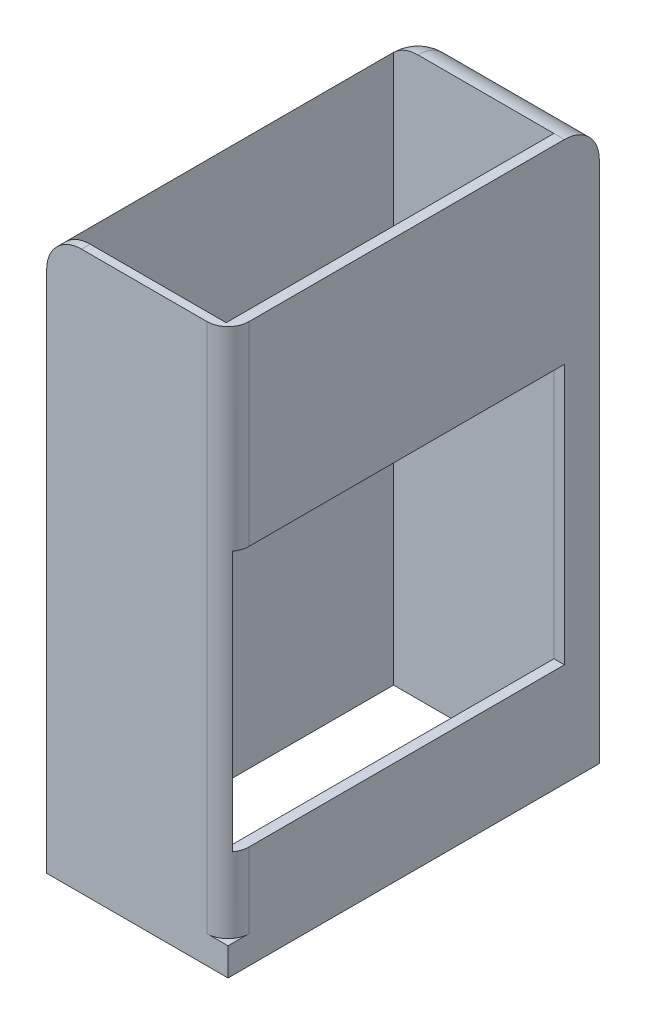
ISO-10303-21;
HEADER;
FILE_DESCRIPTION(('STEP AP214'),'2;1');
FILE_NAME('part.step','',(''),(''),'','','');
FILE_SCHEMA(('AUTOMOTIVE_DESIGN { 1 0 10303 214 1 1 1 1 }'));
ENDSEC;
DATA;
#1=APPLICATION_CONTEXT('core data for automotive mechanical design processes');
#2=APPLICATION_PROTOCOL_DEFINITION('international standard','automotive_design',2000,#1);
#3=PRODUCT_CONTEXT('',#1,'mechanical');
#4=PRODUCT('Part','Part','',(#3));
#5=PRODUCT_RELATED_PRODUCT_CATEGORY('part','',(#4));
#6=PRODUCT_DEFINITION_FORMATION('','',#4);
#7=PRODUCT_DEFINITION_CONTEXT('part definition',#1,'design');
#8=PRODUCT_DEFINITION('design','',#6,#7);
#9=PRODUCT_DEFINITION_SHAPE('','',#8);
#10=(LENGTH_UNIT() NAMED_UNIT(*) SI_UNIT(.MILLI.,.METRE.));
#11=(NAMED_UNIT(*) PLANE_ANGLE_UNIT() SI_UNIT($,.RADIAN.));
#12=(NAMED_UNIT(*) SI_UNIT($,.STERADIAN.) SOLID_ANGLE_UNIT());
#13=UNCERTAINTY_MEASURE_WITH_UNIT(LENGTH_MEASURE(1.E-05),#10,'distance_accuracy_value','');
#14=(GEOMETRIC_REPRESENTATION_CONTEXT(3) GLOBAL_UNCERTAINTY_ASSIGNED_CONTEXT((#13)) GLOBAL_UNIT_ASSIGNED_CONTEXT((#10,
#11,#12)) REPRESENTATION_CONTEXT('',''));
#15=CARTESIAN_POINT('',(0.,0.,0.));
#16=DIRECTION('',(0.,0.,1.));
#17=DIRECTION('',(1.,0.,0.));
#18=AXIS2_PLACEMENT_3D('',#15,#16,#17);
#19=CARTESIAN_POINT('',(0.,4.,0.));
#20=DIRECTION('',(0.,-1.,0.));
#21=DIRECTION('',(0.,0.,-1.));
#22=AXIS2_PLACEMENT_3D('',#19,#20,#21);
#23=PLANE('',#22);
#24=DIRECTION('',(1.,0.,0.));
#25=VECTOR('',#24,1.);
#26=CARTESIAN_POINT('',(0.,4.,-142.215410362873));
#27=LINE('',#26,#25);
#28=CARTESIAN_POINT('',(-3.,4.,-142.215410362873));
#29=VERTEX_POINT('',#28);
#30=CARTESIAN_POINT('',(0.,4.,-142.215410362873));
#31=VERTEX_POINT('',#30);
#32=EDGE_CURVE('E57',#29,#31,#27,.T.);
#33=ORIENTED_EDGE('',*,*,#32,.T.);
#34=DIRECTION('',(0.,0.,-1.));
#35=VECTOR('',#34,1.);
#36=CARTESIAN_POINT('',(0.,4.,0.));
#37=LINE('',#36,#35);
#38=CARTESIAN_POINT('',(0.,4.,-145.215410362873));
#39=VERTEX_POINT('',#38);
#40=EDGE_CURVE('E50',#31,#39,#37,.T.);
#41=ORIENTED_EDGE('',*,*,#40,.T.);
#42=CARTESIAN_POINT('',(-3.,4.,-145.215410362873));
#43=DIRECTION('',(0.,-1.,0.));
#44=DIRECTION('',(0.,0.,-1.));
#45=AXIS2_PLACEMENT_3D('',#42,#43,#44);
#46=CIRCLE('',#45,3.);
#47=EDGE_CURVE('E11',#39,#29,#46,.T.);
#48=ORIENTED_EDGE('',*,*,#47,.T.);
#49=EDGE_LOOP('',(#33,#41,#48));
#50=FACE_BOUND('',#49,.T.);
#51=ADVANCED_FACE('F35',(#50),#23,.F.);
#52=CARTESIAN_POINT('',(0.,80.,-192.37));
#53=DIRECTION('',(-1.,0.,0.));
#54=DIRECTION('',(0.,0.,1.));
#55=AXIS2_PLACEMENT_3D('',#52,#53,#54);
#56=PLANE('',#55);
#57=DIRECTION('',(0.,-1.,0.));
#58=VECTOR('',#57,1.);
#59=CARTESIAN_POINT('',(0.,80.,-145.215410362873));
#60=LINE('',#59,#58);
#61=CARTESIAN_POINT('',(0.,14.7686564288847,-145.215410362873));
#62=VERTEX_POINT('',#61);
#63=EDGE_CURVE('E287',#62,#39,#60,.T.);
#64=ORIENTED_EDGE('',*,*,#63,.T.);
#65=ORIENTED_EDGE('',*,*,#40,.F.);
#66=DIRECTION('',(0.,-1.,0.));
#67=VECTOR('',#66,1.);
#68=CARTESIAN_POINT('',(0.,90.,-142.215410362873));
#69=LINE('',#68,#67);
#70=CARTESIAN_POINT('',(0.,0.,-142.215410362873));
#71=VERTEX_POINT('',#70);
#72=EDGE_CURVE('E162',#31,#71,#69,.T.);
#73=ORIENTED_EDGE('',*,*,#72,.T.);
#74=DIRECTION('',(0.,0.,-1.));
#75=VECTOR('',#74,1.);
#76=CARTESIAN_POINT('',(0.,0.,-195.45));
#77=LINE('',#76,#75);
#78=CARTESIAN_POINT('',(0.,0.,-195.45));
#79=VERTEX_POINT('',#78);
#80=EDGE_CURVE('E166',#71,#79,#77,.T.);
#81=ORIENTED_EDGE('',*,*,#80,.T.);
#82=DIRECTION('',(0.,-1.,0.));
#83=VECTOR('',#82,1.);
#84=CARTESIAN_POINT('',(0.,90.,-195.45));
#85=LINE('',#84,#83);
#86=CARTESIAN_POINT('',(0.,75.,-195.45));
#87=VERTEX_POINT('',#86);
#88=EDGE_CURVE('E169',#87,#79,#85,.T.);
#89=ORIENTED_EDGE('',*,*,#88,.F.);
#90=CARTESIAN_POINT('',(0.,75.,-190.45));
#91=DIRECTION('',(-1.,0.,0.));
#92=DIRECTION('',(0.,0.,1.));
#93=AXIS2_PLACEMENT_3D('',#90,#91,#92);
#94=CIRCLE('',#93,5.);
#95=CARTESIAN_POINT('',(0.,80.,-190.45));
#96=VERTEX_POINT('',#95);
#97=EDGE_CURVE('E285',#87,#96,#94,.F.);
#98=ORIENTED_EDGE('',*,*,#97,.T.);
#99=DIRECTION('',(0.,0.,-1.));
#100=VECTOR('',#99,1.);
#101=CARTESIAN_POINT('',(0.,80.,-192.37));
#102=LINE('',#101,#100);
#103=CARTESIAN_POINT('',(0.,80.,-145.215410362873));
#104=VERTEX_POINT('',#103);
#105=EDGE_CURVE('E231',#104,#96,#102,.T.);
#106=ORIENTED_EDGE('',*,*,#105,.F.);
#107=DIRECTION('',(0.,-1.,0.));
#108=VECTOR('',#107,1.);
#109=CARTESIAN_POINT('',(0.,80.,-145.215410362873));
#110=LINE('',#109,#108);
#111=CARTESIAN_POINT('',(0.,52.0903748862338,-145.215410362873));
#112=VERTEX_POINT('',#111);
#113=EDGE_CURVE('E294',#104,#112,#110,.T.);
#114=ORIENTED_EDGE('',*,*,#113,.T.);
#115=DIRECTION('',(0.,0.,-1.));
#116=VECTOR('',#115,1.);
#117=CARTESIAN_POINT('',(0.,52.0903748862338,-192.37));
#118=LINE('',#117,#116);
#119=CARTESIAN_POINT('',(0.,52.0903748862338,-190.451816040485));
#120=VERTEX_POINT('',#119);
#121=EDGE_CURVE('E210',#112,#120,#118,.T.);
#122=ORIENTED_EDGE('',*,*,#121,.T.);
#123=DIRECTION('',(0.,-1.,0.));
#124=VECTOR('',#123,1.);
#125=CARTESIAN_POINT('',(0.,80.,-190.451816040485));
#126=LINE('',#125,#124);
#127=CARTESIAN_POINT('',(0.,14.7686564288847,-190.451816040485));
#128=VERTEX_POINT('',#127);
#129=EDGE_CURVE('E258',#120,#128,#126,.T.);
#130=ORIENTED_EDGE('',*,*,#129,.T.);
#131=DIRECTION('',(0.,0.,1.));
#132=VECTOR('',#131,1.);
#133=CARTESIAN_POINT('',(0.,14.7686564288847,-192.37));
#134=LINE('',#133,#132);
#135=EDGE_CURVE('E217',#128,#62,#134,.T.);
#136=ORIENTED_EDGE('',*,*,#135,.T.);
#137=EDGE_LOOP('',(#64,#65,#73,#81,#89,#98,#106,#114,#122,#130,#136));
#138=FACE_BOUND('',#137,.T.);
#139=ADVANCED_FACE('F164',(#138),#56,.F.);
#140=CARTESIAN_POINT('',(79.9999999999999,80.,-195.45));
#141=DIRECTION('',(0.,0.,-1.));
#142=DIRECTION('',(-1.,0.,0.));
#143=AXIS2_PLACEMENT_3D('',#140,#141,#142);
#144=PLANE('',#143);
#145=ORIENTED_EDGE('',*,*,#88,.T.);
#146=DIRECTION('',(1.,0.,0.));
#147=VECTOR('',#146,1.);
#148=CARTESIAN_POINT('',(79.9999999999999,0.,-195.45));
#149=LINE('',#148,#147);
#150=CARTESIAN_POINT('',(-21.,0.,-195.45));
#151=VERTEX_POINT('',#150);
#152=EDGE_CURVE('E179',#151,#79,#149,.T.);
#153=ORIENTED_EDGE('',*,*,#152,.F.);
#154=DIRECTION('',(0.,-1.,0.));
#155=VECTOR('',#154,1.);
#156=CARTESIAN_POINT('',(-21.,80.,-195.45));
#157=LINE('',#156,#155);
#158=CARTESIAN_POINT('',(-21.,75.,-195.45));
#159=VERTEX_POINT('',#158);
#160=EDGE_CURVE('E276',#151,#159,#157,.F.);
#161=ORIENTED_EDGE('',*,*,#160,.T.);
#162=DIRECTION('',(1.,0.,0.));
#163=VECTOR('',#162,1.);
#164=CARTESIAN_POINT('',(79.9999999999999,75.,-195.45));
#165=LINE('',#164,#163);
#166=EDGE_CURVE('E273',#159,#87,#165,.T.);
#167=ORIENTED_EDGE('',*,*,#166,.T.);
#168=EDGE_LOOP('',(#145,#153,#161,#167));
#169=FACE_BOUND('',#168,.T.);
#170=ADVANCED_FACE('F373',(#169),#144,.T.);
#171=CARTESIAN_POINT('',(-26.,80.,-195.45));
#172=DIRECTION('',(-1.,0.,0.));
#173=DIRECTION('',(0.,0.,1.));
#174=AXIS2_PLACEMENT_3D('',#171,#172,#173);
#175=PLANE('',#174);
#176=DIRECTION('',(0.,1.,0.));
#177=VECTOR('',#176,1.);
#178=CARTESIAN_POINT('',(-26.,-12.,-142.215410362873));
#179=LINE('',#178,#177);
#180=CARTESIAN_POINT('',(-26.,0.,-142.215410362873));
#181=VERTEX_POINT('',#180);
#182=CARTESIAN_POINT('',(-26.,75.,-142.215410362873));
#183=VERTEX_POINT('',#182);
#184=EDGE_CURVE('E183',#181,#183,#179,.T.);
#185=ORIENTED_EDGE('',*,*,#184,.T.);
#186=DIRECTION('',(0.,0.,-1.));
#187=VECTOR('',#186,1.);
#188=CARTESIAN_POINT('',(-26.,75.,-195.45));
#189=LINE('',#188,#187);
#190=CARTESIAN_POINT('',(-26.,75.,-190.45));
#191=VERTEX_POINT('',#190);
#192=EDGE_CURVE('E268',#183,#191,#189,.T.);
#193=ORIENTED_EDGE('',*,*,#192,.T.);
#194=DIRECTION('',(0.,-1.,0.));
#195=VECTOR('',#194,1.);
#196=CARTESIAN_POINT('',(-26.,80.,-190.45));
#197=LINE('',#196,#195);
#198=CARTESIAN_POINT('',(-26.,0.,-190.45));
#199=VERTEX_POINT('',#198);
#200=EDGE_CURVE('E270',#191,#199,#197,.T.);
#201=ORIENTED_EDGE('',*,*,#200,.T.);
#202=DIRECTION('',(0.,0.,-1.));
#203=VECTOR('',#202,1.);
#204=CARTESIAN_POINT('',(-26.,0.,-195.45));
#205=LINE('',#204,#203);
#206=EDGE_CURVE('E243',#181,#199,#205,.T.);
#207=ORIENTED_EDGE('',*,*,#206,.F.);
#208=EDGE_LOOP('',(#185,#193,#201,#207));
#209=FACE_BOUND('',#208,.T.);
#210=ADVANCED_FACE('F351',(#209),#175,.T.);
#211=CARTESIAN_POINT('',(0.,80.,0.));
#212=DIRECTION('',(0.,-1.,0.));
#213=DIRECTION('',(0.,0.,-1.));
#214=AXIS2_PLACEMENT_3D('',#211,#212,#213);
#215=PLANE('',#214);
#216=DIRECTION('',(-1.,0.,0.));
#217=VECTOR('',#216,1.);
#218=CARTESIAN_POINT('',(-26.,80.,-142.215410362873));
#219=LINE('',#218,#217);
#220=CARTESIAN_POINT('',(-3.,80.,-142.215410362873));
#221=VERTEX_POINT('',#220);
#222=CARTESIAN_POINT('',(-21.,80.,-142.215410362873));
#223=VERTEX_POINT('',#222);
#224=EDGE_CURVE('E309',#221,#223,#219,.T.);
#225=ORIENTED_EDGE('',*,*,#224,.F.);
#226=CARTESIAN_POINT('',(-3.,80.,-145.215410362873));
#227=DIRECTION('',(0.,-1.,0.));
#228=DIRECTION('',(0.,0.,-1.));
#229=AXIS2_PLACEMENT_3D('',#226,#227,#228);
#230=CIRCLE('',#229,3.);
#231=EDGE_CURVE('E43',#221,#104,#230,.F.);
#232=ORIENTED_EDGE('',*,*,#231,.T.);
#233=ORIENTED_EDGE('',*,*,#105,.T.);
#234=DIRECTION('',(1.,0.,0.));
#235=VECTOR('',#234,1.);
#236=CARTESIAN_POINT('',(-26.,80.,-190.45));
#237=LINE('',#236,#235);
#238=CARTESIAN_POINT('',(-1.5,80.,-190.45));
#239=VERTEX_POINT('',#238);
#240=EDGE_CURVE('E263',#96,#239,#237,.F.);
#241=ORIENTED_EDGE('',*,*,#240,.T.);
#242=DIRECTION('',(0.,0.,-1.));
#243=VECTOR('',#242,1.);
#244=CARTESIAN_POINT('',(-1.5,80.,-190.45));
#245=LINE('',#244,#243);
#246=CARTESIAN_POINT('',(-1.49999999999999,80.,-143.45));
#247=VERTEX_POINT('',#246);
#248=EDGE_CURVE('E222',#247,#239,#245,.T.);
#249=ORIENTED_EDGE('',*,*,#248,.F.);
#250=DIRECTION('',(1.,0.,0.));
#251=VECTOR('',#250,1.);
#252=CARTESIAN_POINT('',(-24.5,80.,-143.45));
#253=LINE('',#252,#251);
#254=CARTESIAN_POINT('',(-21.,80.,-143.45));
#255=VERTEX_POINT('',#254);
#256=EDGE_CURVE('E220',#255,#247,#253,.T.);
#257=ORIENTED_EDGE('',*,*,#256,.F.);
#258=DIRECTION('',(0.,0.,-1.));
#259=VECTOR('',#258,1.);
#260=CARTESIAN_POINT('',(-21.,80.,-195.45));
#261=LINE('',#260,#259);
#262=EDGE_CURVE('E265',#255,#223,#261,.F.);
#263=ORIENTED_EDGE('',*,*,#262,.T.);
#264=EDGE_LOOP('',(#225,#232,#233,#241,#249,#257,#263));
#265=FACE_BOUND('',#264,.T.);
#266=ADVANCED_FACE('F308',(#265),#215,.F.);
#267=CARTESIAN_POINT('',(0.,0.,0.));
#268=DIRECTION('',(0.,-1.,0.));
#269=DIRECTION('',(0.,0.,-1.));
#270=AXIS2_PLACEMENT_3D('',#267,#268,#269);
#271=PLANE('',#270);
#272=ORIENTED_EDGE('',*,*,#80,.F.);
#273=DIRECTION('',(1.,0.,0.));
#274=VECTOR('',#273,1.);
#275=CARTESIAN_POINT('',(0.,0.,-142.215410362873));
#276=LINE('',#275,#274);
#277=EDGE_CURVE('E176',#181,#71,#276,.T.);
#278=ORIENTED_EDGE('',*,*,#277,.F.);
#279=ORIENTED_EDGE('',*,*,#206,.T.);
#280=CARTESIAN_POINT('',(-21.,0.,-190.45));
#281=DIRECTION('',(0.,-1.,0.));
#282=DIRECTION('',(0.,0.,-1.));
#283=AXIS2_PLACEMENT_3D('',#280,#281,#282);
#284=CIRCLE('',#283,5.);
#285=EDGE_CURVE('E261',#199,#151,#284,.T.);
#286=ORIENTED_EDGE('',*,*,#285,.T.);
#287=ORIENTED_EDGE('',*,*,#152,.T.);
#288=EDGE_LOOP('',(#272,#278,#279,#286,#287));
#289=FACE_BOUND('',#288,.T.);
#290=DIRECTION('',(0.,0.,-1.));
#291=VECTOR('',#290,1.);
#292=CARTESIAN_POINT('',(-24.5,0.,0.));
#293=LINE('',#292,#291);
#294=CARTESIAN_POINT('',(-24.5,0.,-143.45));
#295=VERTEX_POINT('',#294);
#296=CARTESIAN_POINT('',(-24.5,0.,-190.45));
#297=VERTEX_POINT('',#296);
#298=EDGE_CURVE('E253',#295,#297,#293,.T.);
#299=ORIENTED_EDGE('',*,*,#298,.F.);
#300=DIRECTION('',(-1.,0.,0.));
#301=VECTOR('',#300,1.);
#302=CARTESIAN_POINT('',(0.,0.,-143.45));
#303=LINE('',#302,#301);
#304=CARTESIAN_POINT('',(-1.49999999999999,0.,-143.45));
#305=VERTEX_POINT('',#304);
#306=EDGE_CURVE('E246',#305,#295,#303,.T.);
#307=ORIENTED_EDGE('',*,*,#306,.F.);
#308=DIRECTION('',(0.,0.,1.));
#309=VECTOR('',#308,1.);
#310=CARTESIAN_POINT('',(-1.49999999999997,0.,0.));
#311=LINE('',#310,#309);
#312=CARTESIAN_POINT('',(-1.5,0.,-190.45));
#313=VERTEX_POINT('',#312);
#314=EDGE_CURVE('E248',#313,#305,#311,.T.);
#315=ORIENTED_EDGE('',*,*,#314,.F.);
#316=DIRECTION('',(1.,0.,0.));
#317=VECTOR('',#316,1.);
#318=CARTESIAN_POINT('',(0.,0.,-190.45));
#319=LINE('',#318,#317);
#320=EDGE_CURVE('E251',#297,#313,#319,.T.);
#321=ORIENTED_EDGE('',*,*,#320,.F.);
#322=EDGE_LOOP('',(#299,#307,#315,#321));
#323=FACE_BOUND('',#322,.T.);
#324=ADVANCED_FACE('F174',(#289,#323),#271,.T.);
#325=CARTESIAN_POINT('',(-24.5,-30.2665062805837,-190.45));
#326=DIRECTION('',(-1.,0.,0.));
#327=DIRECTION('',(0.,0.,1.));
#328=AXIS2_PLACEMENT_3D('',#325,#326,#327);
#329=PLANE('',#328);
#330=DIRECTION('',(0.,1.,0.));
#331=VECTOR('',#330,1.);
#332=CARTESIAN_POINT('',(-24.5,-30.2665062805837,-190.45));
#333=LINE('',#332,#331);
#334=CARTESIAN_POINT('',(-24.5,78.5707142142714,-190.45));
#335=VERTEX_POINT('',#334);
#336=EDGE_CURVE('E228',#297,#335,#333,.T.);
#337=ORIENTED_EDGE('',*,*,#336,.T.);
#338=DIRECTION('',(0.,0.,1.));
#339=VECTOR('',#338,1.);
#340=CARTESIAN_POINT('',(-24.5,78.5707142142714,-195.45));
#341=LINE('',#340,#339);
#342=CARTESIAN_POINT('',(-24.5,78.5707142142714,-143.45));
#343=VERTEX_POINT('',#342);
#344=EDGE_CURVE('E281',#335,#343,#341,.T.);
#345=ORIENTED_EDGE('',*,*,#344,.T.);
#346=DIRECTION('',(0.,1.,0.));
#347=VECTOR('',#346,1.);
#348=CARTESIAN_POINT('',(-24.5,-30.2665062805837,-143.45));
#349=LINE('',#348,#347);
#350=EDGE_CURVE('E227',#295,#343,#349,.T.);
#351=ORIENTED_EDGE('',*,*,#350,.F.);
#352=ORIENTED_EDGE('',*,*,#298,.T.);
#353=EDGE_LOOP('',(#337,#345,#351,#352));
#354=FACE_BOUND('',#353,.T.);
#355=ADVANCED_FACE('F390',(#354),#329,.F.);
#356=CARTESIAN_POINT('',(-24.5,-30.2665062805837,-190.45));
#357=DIRECTION('',(0.,0.,-1.));
#358=DIRECTION('',(-1.,0.,0.));
#359=AXIS2_PLACEMENT_3D('',#356,#357,#358);
#360=PLANE('',#359);
#361=DIRECTION('',(-1.,0.,0.));
#362=VECTOR('',#361,1.);
#363=CARTESIAN_POINT('',(-24.5,80.,-190.45));
#364=LINE('',#363,#362);
#365=CARTESIAN_POINT('',(-21.,80.,-190.45));
#366=VERTEX_POINT('',#365);
#367=EDGE_CURVE('E225',#239,#366,#364,.T.);
#368=ORIENTED_EDGE('',*,*,#367,.T.);
#369=CARTESIAN_POINT('',(-21.,75.,-190.45));
#370=DIRECTION('',(0.,0.,-1.));
#371=DIRECTION('',(-1.,0.,0.));
#372=AXIS2_PLACEMENT_3D('',#369,#370,#371);
#373=CIRCLE('',#372,5.);
#374=EDGE_CURVE('E278',#366,#335,#373,.F.);
#375=ORIENTED_EDGE('',*,*,#374,.T.);
#376=ORIENTED_EDGE('',*,*,#336,.F.);
#377=ORIENTED_EDGE('',*,*,#320,.T.);
#378=DIRECTION('',(0.,1.,0.));
#379=VECTOR('',#378,1.);
#380=CARTESIAN_POINT('',(-1.5,-30.2665062805837,-190.45));
#381=LINE('',#380,#379);
#382=CARTESIAN_POINT('',(-1.49999999999997,14.7686564288847,-190.45));
#383=VERTEX_POINT('',#382);
#384=EDGE_CURVE('E232',#313,#383,#381,.T.);
#385=ORIENTED_EDGE('',*,*,#384,.T.);
#386=CARTESIAN_POINT('',(-1.49999999999997,52.0903748862338,-190.45));
#387=VERTEX_POINT('',#386);
#388=EDGE_CURVE('E235',#383,#387,#381,.T.);
#389=ORIENTED_EDGE('',*,*,#388,.T.);
#390=EDGE_CURVE('E236',#387,#239,#381,.T.);
#391=ORIENTED_EDGE('',*,*,#390,.T.);
#392=EDGE_LOOP('',(#368,#375,#376,#377,#385,#389,#391));
#393=FACE_BOUND('',#392,.T.);
#394=ADVANCED_FACE('F410',(#393),#360,.F.);
#395=CARTESIAN_POINT('',(-1.5,-30.2665062805837,-190.45));
#396=DIRECTION('',(1.,0.,0.));
#397=DIRECTION('',(0.,0.,-1.));
#398=AXIS2_PLACEMENT_3D('',#395,#396,#397);
#399=PLANE('',#398);
#400=DIRECTION('',(0.,1.,0.));
#401=VECTOR('',#400,1.);
#402=CARTESIAN_POINT('',(-1.49999999999997,52.0903748862338,-143.451816040485));
#403=LINE('',#402,#401);
#404=CARTESIAN_POINT('',(-1.49999999999999,14.7686564288847,-143.451816040485));
#405=VERTEX_POINT('',#404);
#406=CARTESIAN_POINT('',(-1.49999999999997,52.0903748862338,-143.451816040485));
#407=VERTEX_POINT('',#406);
#408=EDGE_CURVE('E196',#405,#407,#403,.T.);
#409=ORIENTED_EDGE('',*,*,#408,.F.);
#410=DIRECTION('',(0.,0.,-1.));
#411=VECTOR('',#410,1.);
#412=CARTESIAN_POINT('',(-1.5,14.7686564288847,-190.45));
#413=LINE('',#412,#411);
#414=EDGE_CURVE('E255',#405,#383,#413,.T.);
#415=ORIENTED_EDGE('',*,*,#414,.T.);
#416=ORIENTED_EDGE('',*,*,#384,.F.);
#417=ORIENTED_EDGE('',*,*,#314,.T.);
#418=DIRECTION('',(0.,1.,0.));
#419=VECTOR('',#418,1.);
#420=CARTESIAN_POINT('',(-1.49999999999999,-30.2665062805837,-143.45));
#421=LINE('',#420,#419);
#422=EDGE_CURVE('E237',#305,#247,#421,.T.);
#423=ORIENTED_EDGE('',*,*,#422,.T.);
#424=ORIENTED_EDGE('',*,*,#248,.T.);
#425=ORIENTED_EDGE('',*,*,#390,.F.);
#426=DIRECTION('',(0.,0.,-1.));
#427=VECTOR('',#426,1.);
#428=CARTESIAN_POINT('',(-1.49999999999997,52.0903748862338,-190.451816040485));
#429=LINE('',#428,#427);
#430=EDGE_CURVE('E201',#407,#387,#429,.T.);
#431=ORIENTED_EDGE('',*,*,#430,.F.);
#432=EDGE_LOOP('',(#409,#415,#416,#417,#423,#424,#425,#431));
#433=FACE_BOUND('',#432,.T.);
#434=ADVANCED_FACE('F329',(#433),#399,.F.);
#435=CARTESIAN_POINT('',(-24.5,-30.2665062805837,-143.45));
#436=DIRECTION('',(0.,0.,1.));
#437=DIRECTION('',(1.,0.,0.));
#438=AXIS2_PLACEMENT_3D('',#435,#436,#437);
#439=PLANE('',#438);
#440=ORIENTED_EDGE('',*,*,#350,.T.);
#441=CARTESIAN_POINT('',(-21.,75.,-143.45));
#442=DIRECTION('',(0.,0.,1.));
#443=DIRECTION('',(1.,0.,0.));
#444=AXIS2_PLACEMENT_3D('',#441,#442,#443);
#445=CIRCLE('',#444,5.);
#446=EDGE_CURVE('E283',#343,#255,#445,.F.);
#447=ORIENTED_EDGE('',*,*,#446,.T.);
#448=ORIENTED_EDGE('',*,*,#256,.T.);
#449=ORIENTED_EDGE('',*,*,#422,.F.);
#450=ORIENTED_EDGE('',*,*,#306,.T.);
#451=EDGE_LOOP('',(#440,#447,#448,#449,#450));
#452=FACE_BOUND('',#451,.T.);
#453=ADVANCED_FACE('F416',(#452),#439,.F.);
#454=CARTESIAN_POINT('',(1.76650628058369,14.7686564288847,-190.451816040485));
#455=DIRECTION('',(0.,0.,-1.));
#456=DIRECTION('',(-1.,0.,0.));
#457=AXIS2_PLACEMENT_3D('',#454,#455,#456);
#458=PLANE('',#457);
#459=DIRECTION('',(-1.,0.,0.));
#460=VECTOR('',#459,1.);
#461=CARTESIAN_POINT('',(1.76650628058369,52.0903748862338,-190.451816040485));
#462=LINE('',#461,#460);
#463=CARTESIAN_POINT('',(-1.49999999999997,52.0903748862338,-190.451816040485));
#464=VERTEX_POINT('',#463);
#465=EDGE_CURVE('E211',#120,#464,#462,.T.);
#466=ORIENTED_EDGE('',*,*,#465,.T.);
#467=DIRECTION('',(0.,-1.,0.));
#468=VECTOR('',#467,1.);
#469=CARTESIAN_POINT('',(-1.49999999999997,14.7686564288847,-190.451816040485));
#470=LINE('',#469,#468);
#471=CARTESIAN_POINT('',(-1.49999999999997,14.7686564288847,-190.451816040485));
#472=VERTEX_POINT('',#471);
#473=EDGE_CURVE('E204',#464,#472,#470,.T.);
#474=ORIENTED_EDGE('',*,*,#473,.T.);
#475=DIRECTION('',(-1.,0.,0.));
#476=VECTOR('',#475,1.);
#477=CARTESIAN_POINT('',(1.76650628058369,14.7686564288847,-190.451816040485));
#478=LINE('',#477,#476);
#479=EDGE_CURVE('E208',#128,#472,#478,.T.);
#480=ORIENTED_EDGE('',*,*,#479,.F.);
#481=ORIENTED_EDGE('',*,*,#129,.F.);
#482=EDGE_LOOP('',(#466,#474,#480,#481));
#483=FACE_BOUND('',#482,.T.);
#484=ADVANCED_FACE('F339',(#483),#458,.F.);
#485=CARTESIAN_POINT('',(-1.49999999999997,0.,0.));
#486=DIRECTION('',(1.,0.,0.));
#487=DIRECTION('',(0.,0.,-1.));
#488=AXIS2_PLACEMENT_3D('',#485,#486,#487);
#489=PLANE('',#488);
#490=ORIENTED_EDGE('',*,*,#388,.F.);
#491=DIRECTION('',(0.,0.,1.));
#492=VECTOR('',#491,1.);
#493=CARTESIAN_POINT('',(-1.49999999999997,14.7686564288847,-143.451816040485));
#494=LINE('',#493,#492);
#495=EDGE_CURVE('E193',#472,#383,#494,.T.);
#496=ORIENTED_EDGE('',*,*,#495,.F.);
#497=ORIENTED_EDGE('',*,*,#473,.F.);
#498=EDGE_CURVE('E200',#387,#464,#429,.T.);
#499=ORIENTED_EDGE('',*,*,#498,.F.);
#500=EDGE_LOOP('',(#490,#496,#497,#499));
#501=FACE_BOUND('',#500,.T.);
#502=ADVANCED_FACE('F336',(#501),#489,.T.);
#503=CARTESIAN_POINT('',(1.76650628058369,14.7686564288847,-143.451816040485));
#504=DIRECTION('',(0.,-1.,0.));
#505=DIRECTION('',(0.,0.,-1.));
#506=AXIS2_PLACEMENT_3D('',#503,#504,#505);
#507=PLANE('',#506);
#508=DIRECTION('',(-1.,0.,0.));
#509=VECTOR('',#508,1.);
#510=CARTESIAN_POINT('',(1.76650628058369,14.7686564288847,-143.451816040485));
#511=LINE('',#510,#509);
#512=CARTESIAN_POINT('',(-0.573122362779196,14.7686564288847,-143.451816040485));
#513=VERTEX_POINT('',#512);
#514=EDGE_CURVE('E207',#513,#405,#511,.T.);
#515=ORIENTED_EDGE('',*,*,#514,.F.);
#516=CARTESIAN_POINT('',(-3.,14.7686564288847,-145.215410362873));
#517=DIRECTION('',(0.,-1.,0.));
#518=DIRECTION('',(0.,0.,-1.));
#519=AXIS2_PLACEMENT_3D('',#516,#517,#518);
#520=CIRCLE('',#519,3.);
#521=EDGE_CURVE('E301',#513,#62,#520,.F.);
#522=ORIENTED_EDGE('',*,*,#521,.T.);
#523=ORIENTED_EDGE('',*,*,#135,.F.);
#524=ORIENTED_EDGE('',*,*,#479,.T.);
#525=ORIENTED_EDGE('',*,*,#495,.T.);
#526=ORIENTED_EDGE('',*,*,#414,.F.);
#527=EDGE_LOOP('',(#515,#522,#523,#524,#525,#526));
#528=FACE_BOUND('',#527,.T.);
#529=ADVANCED_FACE('F404',(#528),#507,.F.);
#530=CARTESIAN_POINT('',(1.76650628058369,52.0903748862338,-190.451816040485));
#531=DIRECTION('',(0.,1.,0.));
#532=DIRECTION('',(0.,0.,1.));
#533=AXIS2_PLACEMENT_3D('',#530,#531,#532);
#534=PLANE('',#533);
#535=ORIENTED_EDGE('',*,*,#121,.F.);
#536=CARTESIAN_POINT('',(-3.,52.0903748862338,-145.215410362873));
#537=DIRECTION('',(0.,1.,0.));
#538=DIRECTION('',(0.,0.,1.));
#539=AXIS2_PLACEMENT_3D('',#536,#537,#538);
#540=CIRCLE('',#539,3.);
#541=CARTESIAN_POINT('',(-0.573122362779196,52.0903748862338,-143.451816040485));
#542=VERTEX_POINT('',#541);
#543=EDGE_CURVE('E297',#112,#542,#540,.F.);
#544=ORIENTED_EDGE('',*,*,#543,.T.);
#545=DIRECTION('',(-1.,0.,0.));
#546=VECTOR('',#545,1.);
#547=CARTESIAN_POINT('',(1.76650628058369,52.0903748862338,-143.451816040485));
#548=LINE('',#547,#546);
#549=EDGE_CURVE('E213',#542,#407,#548,.T.);
#550=ORIENTED_EDGE('',*,*,#549,.T.);
#551=ORIENTED_EDGE('',*,*,#430,.T.);
#552=ORIENTED_EDGE('',*,*,#498,.T.);
#553=ORIENTED_EDGE('',*,*,#465,.F.);
#554=EDGE_LOOP('',(#535,#544,#550,#551,#552,#553));
#555=FACE_BOUND('',#554,.T.);
#556=ADVANCED_FACE('F319',(#555),#534,.F.);
#557=CARTESIAN_POINT('',(1.76650628058369,52.0903748862338,-143.451816040485));
#558=DIRECTION('',(0.,0.,1.));
#559=DIRECTION('',(1.,0.,0.));
#560=AXIS2_PLACEMENT_3D('',#557,#558,#559);
#561=PLANE('',#560);
#562=ORIENTED_EDGE('',*,*,#549,.F.);
#563=DIRECTION('',(0.,-1.,0.));
#564=VECTOR('',#563,1.);
#565=CARTESIAN_POINT('',(-0.573122362779196,52.0903748862338,-143.451816040485));
#566=LINE('',#565,#564);
#567=EDGE_CURVE('E299',#542,#513,#566,.T.);
#568=ORIENTED_EDGE('',*,*,#567,.T.);
#569=ORIENTED_EDGE('',*,*,#514,.T.);
#570=ORIENTED_EDGE('',*,*,#408,.T.);
#571=EDGE_LOOP('',(#562,#568,#569,#570));
#572=FACE_BOUND('',#571,.T.);
#573=ADVANCED_FACE('F322',(#572),#561,.F.);
#574=CARTESIAN_POINT('',(-21.,80.,-190.45));
#575=DIRECTION('',(0.,-1.,0.));
#576=DIRECTION('',(0.,0.,-1.));
#577=AXIS2_PLACEMENT_3D('',#574,#575,#576);
#578=CYLINDRICAL_SURFACE('',#577,5.);
#579=ORIENTED_EDGE('',*,*,#285,.F.);
#580=ORIENTED_EDGE('',*,*,#200,.F.);
#581=CARTESIAN_POINT('',(-21.,75.,-190.45));
#582=DIRECTION('',(0.,1.,0.));
#583=DIRECTION('',(0.,0.,1.));
#584=AXIS2_PLACEMENT_3D('',#581,#582,#583);
#585=CIRCLE('',#584,5.);
#586=EDGE_CURVE('E197',#159,#191,#585,.T.);
#587=ORIENTED_EDGE('',*,*,#586,.F.);
#588=ORIENTED_EDGE('',*,*,#160,.F.);
#589=EDGE_LOOP('',(#579,#580,#587,#588));
#590=FACE_BOUND('',#589,.T.);
#591=ADVANCED_FACE('F364',(#590),#578,.T.);
#592=CARTESIAN_POINT('',(79.9999999999999,75.,-190.45));
#593=DIRECTION('',(-1.,0.,0.));
#594=DIRECTION('',(0.,0.,1.));
#595=AXIS2_PLACEMENT_3D('',#592,#593,#594);
#596=CYLINDRICAL_SURFACE('',#595,5.);
#597=ORIENTED_EDGE('',*,*,#97,.F.);
#598=ORIENTED_EDGE('',*,*,#166,.F.);
#599=CARTESIAN_POINT('',(-21.,75.,-190.45));
#600=DIRECTION('',(-1.,0.,0.));
#601=DIRECTION('',(0.,0.,1.));
#602=AXIS2_PLACEMENT_3D('',#599,#600,#601);
#603=CIRCLE('',#602,5.);
#604=EDGE_CURVE('E188',#366,#159,#603,.T.);
#605=ORIENTED_EDGE('',*,*,#604,.F.);
#606=ORIENTED_EDGE('',*,*,#367,.F.);
#607=ORIENTED_EDGE('',*,*,#240,.F.);
#608=EDGE_LOOP('',(#597,#598,#605,#606,#607));
#609=FACE_BOUND('',#608,.T.);
#610=ADVANCED_FACE('F371',(#609),#596,.T.);
#611=CARTESIAN_POINT('',(-21.,75.,-190.45));
#612=DIRECTION('',(0.,0.,1.));
#613=DIRECTION('',(1.,0.,0.));
#614=AXIS2_PLACEMENT_3D('',#611,#612,#613);
#615=SPHERICAL_SURFACE('',#614,5.);
#616=ORIENTED_EDGE('',*,*,#604,.T.);
#617=ORIENTED_EDGE('',*,*,#586,.T.);
#618=CARTESIAN_POINT('',(-21.,75.,-190.45));
#619=DIRECTION('',(0.,0.,-1.));
#620=DIRECTION('',(-1.,0.,0.));
#621=AXIS2_PLACEMENT_3D('',#618,#619,#620);
#622=CIRCLE('',#621,5.);
#623=EDGE_CURVE('E184',#335,#191,#622,.F.);
#624=ORIENTED_EDGE('',*,*,#623,.F.);
#625=ORIENTED_EDGE('',*,*,#374,.F.);
#626=EDGE_LOOP('',(#616,#617,#624,#625));
#627=FACE_BOUND('',#626,.T.);
#628=ADVANCED_FACE('F366',(#627),#615,.T.);
#629=CARTESIAN_POINT('',(-21.,75.,-195.45));
#630=DIRECTION('',(0.,0.,1.));
#631=DIRECTION('',(1.,0.,0.));
#632=AXIS2_PLACEMENT_3D('',#629,#630,#631);
#633=CYLINDRICAL_SURFACE('',#632,5.);
#634=CARTESIAN_POINT('',(-21.,75.,-142.215410362873));
#635=DIRECTION('',(0.,0.,-1.));
#636=DIRECTION('',(-1.,0.,0.));
#637=AXIS2_PLACEMENT_3D('',#634,#635,#636);
#638=CIRCLE('',#637,5.);
#639=EDGE_CURVE('E185',#223,#183,#638,.F.);
#640=ORIENTED_EDGE('',*,*,#639,.F.);
#641=ORIENTED_EDGE('',*,*,#262,.F.);
#642=ORIENTED_EDGE('',*,*,#446,.F.);
#643=ORIENTED_EDGE('',*,*,#344,.F.);
#644=ORIENTED_EDGE('',*,*,#623,.T.);
#645=ORIENTED_EDGE('',*,*,#192,.F.);
#646=EDGE_LOOP('',(#640,#641,#642,#643,#644,#645));
#647=FACE_BOUND('',#646,.T.);
#648=ADVANCED_FACE('F354',(#647),#633,.T.);
#649=CARTESIAN_POINT('',(-26.,-12.,-142.215410362873));
#650=DIRECTION('',(0.,0.,-1.));
#651=DIRECTION('',(-1.,0.,0.));
#652=AXIS2_PLACEMENT_3D('',#649,#650,#651);
#653=PLANE('',#652);
#654=ORIENTED_EDGE('',*,*,#277,.T.);
#655=ORIENTED_EDGE('',*,*,#72,.F.);
#656=ORIENTED_EDGE('',*,*,#32,.F.);
#657=DIRECTION('',(0.,-1.,0.));
#658=VECTOR('',#657,1.);
#659=CARTESIAN_POINT('',(-3.,-12.,-142.215410362873));
#660=LINE('',#659,#658);
#661=EDGE_CURVE('E303',#29,#221,#660,.F.);
#662=ORIENTED_EDGE('',*,*,#661,.T.);
#663=ORIENTED_EDGE('',*,*,#224,.T.);
#664=ORIENTED_EDGE('',*,*,#639,.T.);
#665=ORIENTED_EDGE('',*,*,#184,.F.);
#666=EDGE_LOOP('',(#654,#655,#656,#662,#663,#664,#665));
#667=FACE_BOUND('',#666,.T.);
#668=ADVANCED_FACE('F181',(#667),#653,.F.);
#669=CARTESIAN_POINT('',(-3.,80.,-145.215410362873));
#670=DIRECTION('',(0.,-1.,0.));
#671=DIRECTION('',(0.,0.,-1.));
#672=AXIS2_PLACEMENT_3D('',#669,#670,#671);
#673=CYLINDRICAL_SURFACE('',#672,3.);
#674=ORIENTED_EDGE('',*,*,#231,.F.);
#675=ORIENTED_EDGE('',*,*,#661,.F.);
#676=ORIENTED_EDGE('',*,*,#47,.F.);
#677=ORIENTED_EDGE('',*,*,#63,.F.);
#678=ORIENTED_EDGE('',*,*,#521,.F.);
#679=ORIENTED_EDGE('',*,*,#567,.F.);
#680=ORIENTED_EDGE('',*,*,#543,.F.);
#681=ORIENTED_EDGE('',*,*,#113,.F.);
#682=EDGE_LOOP('',(#674,#675,#676,#677,#678,#679,#680,#681));
#683=FACE_BOUND('',#682,.T.);
#684=ADVANCED_FACE('F37',(#683),#673,.T.);
#685=CLOSED_SHELL('',(#51,#139,#170,#210,#266,#324,#355,#394,#434,#453,#484,#502,#529,#556,#573,
#591,#610,#628,#648,#668,#684));
#686=MANIFOLD_SOLID_BREP('B2',#685);
#687=ADVANCED_BREP_SHAPE_REPRESENTATION('',(#18,#686),#14);
#688=SHAPE_DEFINITION_REPRESENTATION(#9,#687);
ENDSEC;
END-ISO-10303-21;
